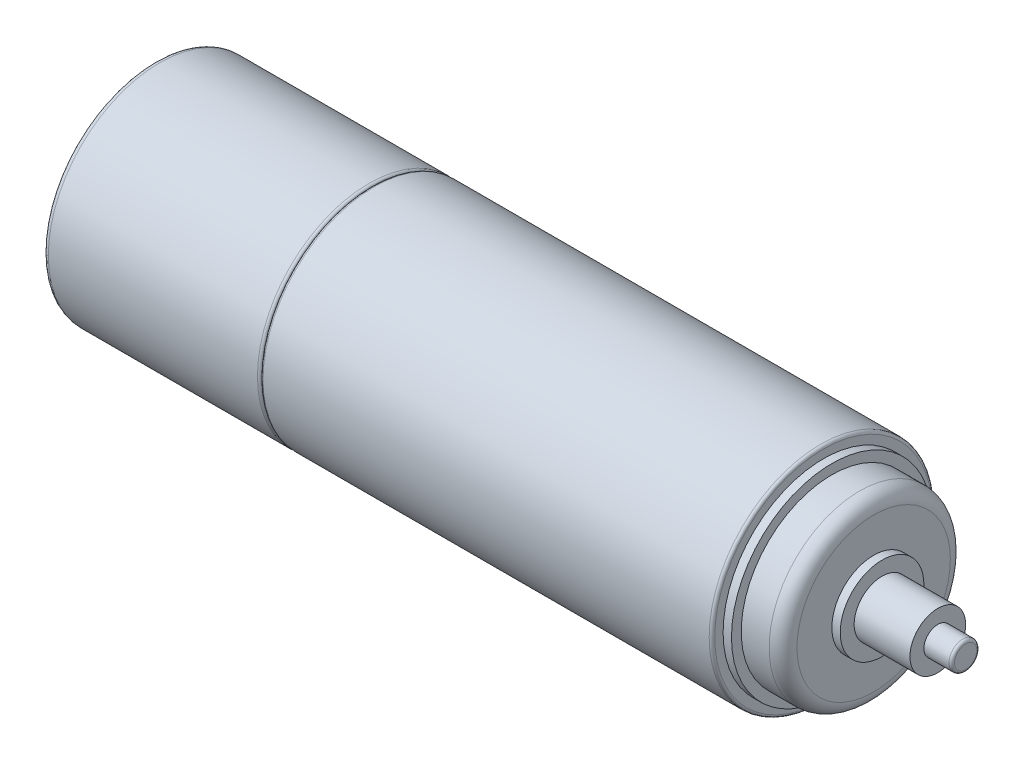
ISO-10303-21;
HEADER;
FILE_DESCRIPTION(('STEP AP214'),'2;1');
FILE_NAME('part.step','',(''),(''),'','','');
FILE_SCHEMA(('AUTOMOTIVE_DESIGN { 1 0 10303 214 1 1 1 1 }'));
ENDSEC;
DATA;
#1=APPLICATION_CONTEXT('core data for automotive mechanical design processes');
#2=APPLICATION_PROTOCOL_DEFINITION('international standard','automotive_design',2000,#1);
#3=PRODUCT_CONTEXT('',#1,'mechanical');
#4=PRODUCT('Part','Part','',(#3));
#5=PRODUCT_RELATED_PRODUCT_CATEGORY('part','',(#4));
#6=PRODUCT_DEFINITION_FORMATION('','',#4);
#7=PRODUCT_DEFINITION_CONTEXT('part definition',#1,'design');
#8=PRODUCT_DEFINITION('design','',#6,#7);
#9=PRODUCT_DEFINITION_SHAPE('','',#8);
#10=(LENGTH_UNIT() NAMED_UNIT(*) SI_UNIT(.MILLI.,.METRE.));
#11=(NAMED_UNIT(*) PLANE_ANGLE_UNIT() SI_UNIT($,.RADIAN.));
#12=(NAMED_UNIT(*) SI_UNIT($,.STERADIAN.) SOLID_ANGLE_UNIT());
#13=UNCERTAINTY_MEASURE_WITH_UNIT(LENGTH_MEASURE(1.E-05),#10,'distance_accuracy_value','');
#14=(GEOMETRIC_REPRESENTATION_CONTEXT(3) GLOBAL_UNCERTAINTY_ASSIGNED_CONTEXT((#13)) GLOBAL_UNIT_ASSIGNED_CONTEXT((#10,
#11,#12)) REPRESENTATION_CONTEXT('',''));
#15=CARTESIAN_POINT('',(0.,0.,0.));
#16=DIRECTION('',(0.,0.,1.));
#17=DIRECTION('',(1.,0.,0.));
#18=AXIS2_PLACEMENT_3D('',#15,#16,#17);
#19=CARTESIAN_POINT('',(16.2,-15.3493565143376,12.114049009447));
#20=DIRECTION('',(-1.,0.,0.));
#21=DIRECTION('',(0.,0.,1.));
#22=AXIS2_PLACEMENT_3D('',#19,#20,#21);
#23=CYLINDRICAL_SURFACE('',#22,4.);
#24=CARTESIAN_POINT('',(16.1,-15.3493565143376,12.114049009447));
#25=DIRECTION('',(1.,0.,0.));
#26=DIRECTION('',(0.,0.,-1.));
#27=AXIS2_PLACEMENT_3D('',#24,#25,#26);
#28=CIRCLE('',#27,4.);
#29=CARTESIAN_POINT('',(16.1,-15.3493565143376,8.11404900944702));
#30=VERTEX_POINT('',#29);
#31=EDGE_CURVE('E55',#30,#30,#28,.F.);
#32=ORIENTED_EDGE('',*,*,#31,.T.);
#33=EDGE_LOOP('',(#32));
#34=FACE_BOUND('',#33,.T.);
#35=CARTESIAN_POINT('',(0.0999999999999994,-15.3493565143376,12.114049009447));
#36=DIRECTION('',(1.,0.,0.));
#37=DIRECTION('',(0.,0.,-1.));
#38=AXIS2_PLACEMENT_3D('',#35,#36,#37);
#39=CIRCLE('',#38,4.);
#40=CARTESIAN_POINT('',(0.0999999999999994,-15.3493565143376,8.11404900944702));
#41=VERTEX_POINT('',#40);
#42=EDGE_CURVE('E64',#41,#41,#39,.T.);
#43=ORIENTED_EDGE('',*,*,#42,.T.);
#44=EDGE_LOOP('',(#43));
#45=FACE_BOUND('',#44,.T.);
#46=ADVANCED_FACE('F32',(#34,#45),#23,.T.);
#47=CARTESIAN_POINT('',(16.2,-15.3493565143376,12.114049009447));
#48=DIRECTION('',(1.,0.,0.));
#49=DIRECTION('',(0.,0.,-1.));
#50=AXIS2_PLACEMENT_3D('',#47,#48,#49);
#51=PLANE('',#50);
#52=CARTESIAN_POINT('',(16.2,-15.3493565143376,12.114049009447));
#53=DIRECTION('',(1.,0.,0.));
#54=DIRECTION('',(0.,0.,-1.));
#55=AXIS2_PLACEMENT_3D('',#52,#53,#54);
#56=CIRCLE('',#55,3.9);
#57=CARTESIAN_POINT('',(16.2,-15.3493565143376,8.21404900944703));
#58=VERTEX_POINT('',#57);
#59=EDGE_CURVE('E58',#58,#58,#56,.T.);
#60=ORIENTED_EDGE('',*,*,#59,.T.);
#61=EDGE_LOOP('',(#60));
#62=FACE_BOUND('',#61,.T.);
#63=CARTESIAN_POINT('',(16.2,-15.3493565143376,12.114049009447));
#64=DIRECTION('',(1.,0.,0.));
#65=DIRECTION('',(0.,0.,-1.));
#66=AXIS2_PLACEMENT_3D('',#63,#64,#65);
#67=CIRCLE('',#66,3.6);
#68=CARTESIAN_POINT('',(16.2,-15.3493565143376,8.51404900944703));
#69=VERTEX_POINT('',#68);
#70=EDGE_CURVE('E76',#69,#69,#67,.T.);
#71=ORIENTED_EDGE('',*,*,#70,.F.);
#72=EDGE_LOOP('',(#71));
#73=FACE_BOUND('',#72,.T.);
#74=ADVANCED_FACE('F142',(#62,#73),#51,.T.);
#75=CARTESIAN_POINT('',(16.5,-15.3493565143376,12.114049009447));
#76=DIRECTION('',(-1.,0.,0.));
#77=DIRECTION('',(0.,0.,1.));
#78=AXIS2_PLACEMENT_3D('',#75,#76,#77);
#79=CYLINDRICAL_SURFACE('',#78,3.6);
#80=CARTESIAN_POINT('',(16.5,-15.3493565143376,12.114049009447));
#81=DIRECTION('',(1.,0.,0.));
#82=DIRECTION('',(0.,0.,-1.));
#83=AXIS2_PLACEMENT_3D('',#80,#81,#82);
#84=CIRCLE('',#83,3.6);
#85=CARTESIAN_POINT('',(16.5,-15.3493565143376,8.51404900944703));
#86=VERTEX_POINT('',#85);
#87=EDGE_CURVE('E79',#86,#86,#84,.T.);
#88=ORIENTED_EDGE('',*,*,#87,.F.);
#89=EDGE_LOOP('',(#88));
#90=FACE_BOUND('',#89,.T.);
#91=ORIENTED_EDGE('',*,*,#70,.T.);
#92=EDGE_LOOP('',(#91));
#93=FACE_BOUND('',#92,.T.);
#94=ADVANCED_FACE('F148',(#90,#93),#79,.T.);
#95=CARTESIAN_POINT('',(16.5,-15.3493565143376,12.114049009447));
#96=DIRECTION('',(1.,0.,0.));
#97=DIRECTION('',(0.,0.,-1.));
#98=AXIS2_PLACEMENT_3D('',#95,#96,#97);
#99=PLANE('',#98);
#100=CARTESIAN_POINT('',(16.5,-15.3493565143376,12.114049009447));
#101=DIRECTION('',(1.,0.,0.));
#102=DIRECTION('',(0.,0.,-1.));
#103=AXIS2_PLACEMENT_3D('',#100,#101,#102);
#104=CIRCLE('',#103,3.25);
#105=CARTESIAN_POINT('',(16.5,-15.3493565143376,8.86404900944703));
#106=VERTEX_POINT('',#105);
#107=EDGE_CURVE('E75',#106,#106,#104,.T.);
#108=ORIENTED_EDGE('',*,*,#107,.F.);
#109=EDGE_LOOP('',(#108));
#110=FACE_BOUND('',#109,.T.);
#111=ORIENTED_EDGE('',*,*,#87,.T.);
#112=EDGE_LOOP('',(#111));
#113=FACE_BOUND('',#112,.T.);
#114=ADVANCED_FACE('F155',(#110,#113),#99,.T.);
#115=CARTESIAN_POINT('',(18.,-15.3493565143376,12.114049009447));
#116=DIRECTION('',(-1.,0.,0.));
#117=DIRECTION('',(0.,0.,1.));
#118=AXIS2_PLACEMENT_3D('',#115,#116,#117);
#119=CYLINDRICAL_SURFACE('',#118,3.25);
#120=CARTESIAN_POINT('',(17.5,-15.3493565143376,12.114049009447));
#121=DIRECTION('',(1.,0.,0.));
#122=DIRECTION('',(0.,0.,-1.));
#123=AXIS2_PLACEMENT_3D('',#120,#121,#122);
#124=CIRCLE('',#123,3.25);
#125=CARTESIAN_POINT('',(17.5,-15.3493565143376,8.86404900944703));
#126=VERTEX_POINT('',#125);
#127=EDGE_CURVE('E68',#126,#126,#124,.F.);
#128=ORIENTED_EDGE('',*,*,#127,.T.);
#129=EDGE_LOOP('',(#128));
#130=FACE_BOUND('',#129,.T.);
#131=ORIENTED_EDGE('',*,*,#107,.T.);
#132=EDGE_LOOP('',(#131));
#133=FACE_BOUND('',#132,.T.);
#134=ADVANCED_FACE('F128',(#130,#133),#119,.T.);
#135=CARTESIAN_POINT('',(18.,-15.3493565143376,12.114049009447));
#136=DIRECTION('',(1.,0.,0.));
#137=DIRECTION('',(0.,0.,-1.));
#138=AXIS2_PLACEMENT_3D('',#135,#136,#137);
#139=PLANE('',#138);
#140=CARTESIAN_POINT('',(18.,-15.3493565143376,12.114049009447));
#141=DIRECTION('',(1.,0.,0.));
#142=DIRECTION('',(0.,0.,-1.));
#143=AXIS2_PLACEMENT_3D('',#140,#141,#142);
#144=CIRCLE('',#143,1.5);
#145=CARTESIAN_POINT('',(18.,-15.3493565143376,10.614049009447));
#146=VERTEX_POINT('',#145);
#147=EDGE_CURVE('E85',#146,#146,#144,.T.);
#148=ORIENTED_EDGE('',*,*,#147,.F.);
#149=EDGE_LOOP('',(#148));
#150=FACE_BOUND('',#149,.T.);
#151=CARTESIAN_POINT('',(18.,-15.3493565143376,12.114049009447));
#152=DIRECTION('',(1.,0.,0.));
#153=DIRECTION('',(0.,0.,-1.));
#154=AXIS2_PLACEMENT_3D('',#151,#152,#153);
#155=CIRCLE('',#154,2.75);
#156=CARTESIAN_POINT('',(18.,-15.3493565143376,9.36404900944703));
#157=VERTEX_POINT('',#156);
#158=EDGE_CURVE('E72',#157,#157,#155,.T.);
#159=ORIENTED_EDGE('',*,*,#158,.T.);
#160=EDGE_LOOP('',(#159));
#161=FACE_BOUND('',#160,.T.);
#162=ADVANCED_FACE('F125',(#150,#161),#139,.T.);
#163=CARTESIAN_POINT('',(17.5,-15.3493565143376,12.114049009447));
#164=DIRECTION('',(1.,0.,0.));
#165=DIRECTION('',(0.,0.,-1.));
#166=AXIS2_PLACEMENT_3D('',#163,#164,#165);
#167=TOROIDAL_SURFACE('',#166,2.75,0.5);
#168=ORIENTED_EDGE('',*,*,#127,.F.);
#169=EDGE_LOOP('',(#168));
#170=FACE_BOUND('',#169,.T.);
#171=ORIENTED_EDGE('',*,*,#158,.F.);
#172=EDGE_LOOP('',(#171));
#173=FACE_BOUND('',#172,.T.);
#174=ADVANCED_FACE('F121',(#170,#173),#167,.T.);
#175=CARTESIAN_POINT('',(18.3,-15.3493565143376,12.114049009447));
#176=DIRECTION('',(-1.,0.,0.));
#177=DIRECTION('',(0.,0.,1.));
#178=AXIS2_PLACEMENT_3D('',#175,#176,#177);
#179=CYLINDRICAL_SURFACE('',#178,1.5);
#180=CARTESIAN_POINT('',(18.3,-15.3493565143376,12.114049009447));
#181=DIRECTION('',(1.,0.,0.));
#182=DIRECTION('',(0.,0.,-1.));
#183=AXIS2_PLACEMENT_3D('',#180,#181,#182);
#184=CIRCLE('',#183,1.5);
#185=CARTESIAN_POINT('',(18.3,-15.3493565143376,10.614049009447));
#186=VERTEX_POINT('',#185);
#187=EDGE_CURVE('E82',#186,#186,#184,.T.);
#188=ORIENTED_EDGE('',*,*,#187,.F.);
#189=EDGE_LOOP('',(#188));
#190=FACE_BOUND('',#189,.T.);
#191=ORIENTED_EDGE('',*,*,#147,.T.);
#192=EDGE_LOOP('',(#191));
#193=FACE_BOUND('',#192,.T.);
#194=ADVANCED_FACE('F115',(#190,#193),#179,.T.);
#195=CARTESIAN_POINT('',(18.3,-15.3493565143376,12.114049009447));
#196=DIRECTION('',(1.,0.,0.));
#197=DIRECTION('',(0.,0.,-1.));
#198=AXIS2_PLACEMENT_3D('',#195,#196,#197);
#199=PLANE('',#198);
#200=CARTESIAN_POINT('',(18.3,-15.3493565143376,12.114049009447));
#201=DIRECTION('',(1.,0.,0.));
#202=DIRECTION('',(0.,0.,-1.));
#203=AXIS2_PLACEMENT_3D('',#200,#201,#202);
#204=CIRCLE('',#203,0.999999999999999);
#205=CARTESIAN_POINT('',(18.3,-15.3493565143376,11.114049009447));
#206=VERTEX_POINT('',#205);
#207=EDGE_CURVE('E71',#206,#206,#204,.T.);
#208=ORIENTED_EDGE('',*,*,#207,.F.);
#209=EDGE_LOOP('',(#208));
#210=FACE_BOUND('',#209,.T.);
#211=ORIENTED_EDGE('',*,*,#187,.T.);
#212=EDGE_LOOP('',(#211));
#213=FACE_BOUND('',#212,.T.);
#214=ADVANCED_FACE('F109',(#210,#213),#199,.T.);
#215=CARTESIAN_POINT('',(20.3,-15.3493565143376,12.114049009447));
#216=DIRECTION('',(-1.,0.,0.));
#217=DIRECTION('',(0.,0.,1.));
#218=AXIS2_PLACEMENT_3D('',#215,#216,#217);
#219=CYLINDRICAL_SURFACE('',#218,0.999999999999999);
#220=CARTESIAN_POINT('',(20.3,-15.3493565143376,12.114049009447));
#221=DIRECTION('',(1.,0.,0.));
#222=DIRECTION('',(0.,0.,-1.));
#223=AXIS2_PLACEMENT_3D('',#220,#221,#222);
#224=CIRCLE('',#223,0.999999999999999);
#225=CARTESIAN_POINT('',(20.3,-15.3493565143376,11.114049009447));
#226=VERTEX_POINT('',#225);
#227=EDGE_CURVE('E88',#226,#226,#224,.T.);
#228=ORIENTED_EDGE('',*,*,#227,.F.);
#229=EDGE_LOOP('',(#228));
#230=FACE_BOUND('',#229,.T.);
#231=ORIENTED_EDGE('',*,*,#207,.T.);
#232=EDGE_LOOP('',(#231));
#233=FACE_BOUND('',#232,.T.);
#234=ADVANCED_FACE('F103',(#230,#233),#219,.T.);
#235=CARTESIAN_POINT('',(20.3,-15.3493565143376,12.114049009447));
#236=DIRECTION('',(1.,0.,0.));
#237=DIRECTION('',(0.,0.,-1.));
#238=AXIS2_PLACEMENT_3D('',#235,#236,#237);
#239=PLANE('',#238);
#240=CARTESIAN_POINT('',(20.3,-15.3493565143376,12.114049009447));
#241=DIRECTION('',(1.,0.,0.));
#242=DIRECTION('',(0.,0.,-1.));
#243=AXIS2_PLACEMENT_3D('',#240,#241,#242);
#244=CIRCLE('',#243,0.500000000000001);
#245=CARTESIAN_POINT('',(20.3,-15.3493565143376,11.614049009447));
#246=VERTEX_POINT('',#245);
#247=EDGE_CURVE('E67',#246,#246,#244,.T.);
#248=ORIENTED_EDGE('',*,*,#247,.F.);
#249=EDGE_LOOP('',(#248));
#250=FACE_BOUND('',#249,.T.);
#251=ORIENTED_EDGE('',*,*,#227,.T.);
#252=EDGE_LOOP('',(#251));
#253=FACE_BOUND('',#252,.T.);
#254=ADVANCED_FACE('F100',(#250,#253),#239,.T.);
#255=CARTESIAN_POINT('',(21.3,-15.3493565143376,12.114049009447));
#256=DIRECTION('',(-1.,0.,0.));
#257=DIRECTION('',(0.,0.,1.));
#258=AXIS2_PLACEMENT_3D('',#255,#256,#257);
#259=CYLINDRICAL_SURFACE('',#258,0.500000000000001);
#260=CARTESIAN_POINT('',(21.2,-15.3493565143376,12.114049009447));
#261=DIRECTION('',(1.,0.,0.));
#262=DIRECTION('',(0.,0.,-1.));
#263=AXIS2_PLACEMENT_3D('',#260,#261,#262);
#264=CIRCLE('',#263,0.500000000000001);
#265=CARTESIAN_POINT('',(21.2,-15.3493565143376,11.614049009447));
#266=VERTEX_POINT('',#265);
#267=EDGE_CURVE('E10',#266,#266,#264,.F.);
#268=ORIENTED_EDGE('',*,*,#267,.T.);
#269=EDGE_LOOP('',(#268));
#270=FACE_BOUND('',#269,.T.);
#271=ORIENTED_EDGE('',*,*,#247,.T.);
#272=EDGE_LOOP('',(#271));
#273=FACE_BOUND('',#272,.T.);
#274=ADVANCED_FACE('F98',(#270,#273),#259,.T.);
#275=CARTESIAN_POINT('',(21.3,-15.3493565143376,12.114049009447));
#276=DIRECTION('',(1.,0.,0.));
#277=DIRECTION('',(0.,0.,-1.));
#278=AXIS2_PLACEMENT_3D('',#275,#276,#277);
#279=PLANE('',#278);
#280=CARTESIAN_POINT('',(21.3,-15.3493565143376,12.114049009447));
#281=DIRECTION('',(1.,0.,0.));
#282=DIRECTION('',(0.,0.,-1.));
#283=AXIS2_PLACEMENT_3D('',#280,#281,#282);
#284=CIRCLE('',#283,0.400000000000001);
#285=CARTESIAN_POINT('',(21.3,-15.3493565143376,11.714049009447));
#286=VERTEX_POINT('',#285);
#287=EDGE_CURVE('E39',#286,#286,#284,.T.);
#288=ORIENTED_EDGE('',*,*,#287,.T.);
#289=EDGE_LOOP('',(#288));
#290=FACE_BOUND('',#289,.T.);
#291=ADVANCED_FACE('F164',(#290),#279,.T.);
#292=CARTESIAN_POINT('',(0.0999999999999994,-15.3493565143376,12.114049009447));
#293=DIRECTION('',(1.,0.,0.));
#294=DIRECTION('',(0.,0.,-1.));
#295=AXIS2_PLACEMENT_3D('',#292,#293,#294);
#296=TOROIDAL_SURFACE('',#295,3.9,0.1);
#297=CARTESIAN_POINT('',(0.,-15.3493565143376,12.114049009447));
#298=DIRECTION('',(1.,0.,0.));
#299=DIRECTION('',(0.,0.,-1.));
#300=AXIS2_PLACEMENT_3D('',#297,#298,#299);
#301=CIRCLE('',#300,3.9);
#302=CARTESIAN_POINT('',(0.,-15.3493565143376,8.21404900944703));
#303=VERTEX_POINT('',#302);
#304=EDGE_CURVE('E61',#303,#303,#301,.F.);
#305=ORIENTED_EDGE('',*,*,#304,.F.);
#306=EDGE_LOOP('',(#305));
#307=FACE_BOUND('',#306,.T.);
#308=ORIENTED_EDGE('',*,*,#42,.F.);
#309=EDGE_LOOP('',(#308));
#310=FACE_BOUND('',#309,.T.);
#311=ADVANCED_FACE('F167',(#307,#310),#296,.T.);
#312=CARTESIAN_POINT('',(16.1,-15.3493565143376,12.114049009447));
#313=DIRECTION('',(1.,0.,0.));
#314=DIRECTION('',(0.,0.,-1.));
#315=AXIS2_PLACEMENT_3D('',#312,#313,#314);
#316=TOROIDAL_SURFACE('',#315,3.9,0.1);
#317=ORIENTED_EDGE('',*,*,#31,.F.);
#318=EDGE_LOOP('',(#317));
#319=FACE_BOUND('',#318,.T.);
#320=ORIENTED_EDGE('',*,*,#59,.F.);
#321=EDGE_LOOP('',(#320));
#322=FACE_BOUND('',#321,.T.);
#323=ADVANCED_FACE('F172',(#319,#322),#316,.T.);
#324=CARTESIAN_POINT('',(-7.8,-15.3493565143376,12.114049009447));
#325=DIRECTION('',(1.,0.,0.));
#326=DIRECTION('',(0.,0.,-1.));
#327=AXIS2_PLACEMENT_3D('',#324,#325,#326);
#328=CYLINDRICAL_SURFACE('',#327,4.);
#329=CARTESIAN_POINT('',(-0.1,-15.3493565143376,12.114049009447));
#330=DIRECTION('',(-1.,0.,0.));
#331=DIRECTION('',(0.,0.,1.));
#332=AXIS2_PLACEMENT_3D('',#329,#330,#331);
#333=CIRCLE('',#332,4.);
#334=CARTESIAN_POINT('',(-0.1,-15.3493565143376,16.114049009447));
#335=VERTEX_POINT('',#334);
#336=EDGE_CURVE('E43',#335,#335,#333,.T.);
#337=ORIENTED_EDGE('',*,*,#336,.T.);
#338=EDGE_LOOP('',(#337));
#339=FACE_BOUND('',#338,.T.);
#340=CARTESIAN_POINT('',(-7.6,-15.3493565143376,12.114049009447));
#341=DIRECTION('',(-1.,0.,0.));
#342=DIRECTION('',(0.,0.,1.));
#343=AXIS2_PLACEMENT_3D('',#340,#341,#342);
#344=CIRCLE('',#343,4.);
#345=CARTESIAN_POINT('',(-7.6,-15.3493565143376,16.114049009447));
#346=VERTEX_POINT('',#345);
#347=EDGE_CURVE('E47',#346,#346,#344,.F.);
#348=ORIENTED_EDGE('',*,*,#347,.T.);
#349=EDGE_LOOP('',(#348));
#350=FACE_BOUND('',#349,.T.);
#351=ADVANCED_FACE('F168',(#339,#350),#328,.T.);
#352=CARTESIAN_POINT('',(-7.8,-15.3493565143376,12.114049009447));
#353=DIRECTION('',(-1.,0.,0.));
#354=DIRECTION('',(0.,0.,1.));
#355=AXIS2_PLACEMENT_3D('',#352,#353,#354);
#356=PLANE('',#355);
#357=CARTESIAN_POINT('',(-7.8,-15.3493565143376,12.114049009447));
#358=DIRECTION('',(-1.,0.,0.));
#359=DIRECTION('',(0.,0.,1.));
#360=AXIS2_PLACEMENT_3D('',#357,#358,#359);
#361=CIRCLE('',#360,3.8);
#362=CARTESIAN_POINT('',(-7.8,-15.3493565143376,15.914049009447));
#363=VERTEX_POINT('',#362);
#364=EDGE_CURVE('E52',#363,#363,#361,.T.);
#365=ORIENTED_EDGE('',*,*,#364,.T.);
#366=EDGE_LOOP('',(#365));
#367=FACE_BOUND('',#366,.T.);
#368=ADVANCED_FACE('F171',(#367),#356,.T.);
#369=CARTESIAN_POINT('',(-7.6,-15.3493565143376,12.114049009447));
#370=DIRECTION('',(-1.,0.,0.));
#371=DIRECTION('',(0.,0.,1.));
#372=AXIS2_PLACEMENT_3D('',#369,#370,#371);
#373=TOROIDAL_SURFACE('',#372,3.8,0.2);
#374=ORIENTED_EDGE('',*,*,#347,.F.);
#375=EDGE_LOOP('',(#374));
#376=FACE_BOUND('',#375,.T.);
#377=ORIENTED_EDGE('',*,*,#364,.F.);
#378=EDGE_LOOP('',(#377));
#379=FACE_BOUND('',#378,.T.);
#380=ADVANCED_FACE('F175',(#376,#379),#373,.T.);
#381=CARTESIAN_POINT('',(-0.1,-15.3493565143376,12.114049009447));
#382=DIRECTION('',(-1.,0.,0.));
#383=DIRECTION('',(0.,0.,1.));
#384=AXIS2_PLACEMENT_3D('',#381,#382,#383);
#385=TOROIDAL_SURFACE('',#384,3.9,0.1);
#386=ORIENTED_EDGE('',*,*,#304,.T.);
#387=EDGE_LOOP('',(#386));
#388=FACE_BOUND('',#387,.T.);
#389=ORIENTED_EDGE('',*,*,#336,.F.);
#390=EDGE_LOOP('',(#389));
#391=FACE_BOUND('',#390,.T.);
#392=ADVANCED_FACE('F180',(#388,#391),#385,.T.);
#393=CARTESIAN_POINT('',(21.2,-15.3493565143376,12.114049009447));
#394=DIRECTION('',(1.,0.,0.));
#395=DIRECTION('',(0.,0.,-1.));
#396=AXIS2_PLACEMENT_3D('',#393,#394,#395);
#397=TOROIDAL_SURFACE('',#396,0.400000000000001,0.1);
#398=ORIENTED_EDGE('',*,*,#267,.F.);
#399=EDGE_LOOP('',(#398));
#400=FACE_BOUND('',#399,.T.);
#401=ORIENTED_EDGE('',*,*,#287,.F.);
#402=EDGE_LOOP('',(#401));
#403=FACE_BOUND('',#402,.T.);
#404=ADVANCED_FACE('F34',(#400,#403),#397,.T.);
#405=CLOSED_SHELL('',(#46,#74,#94,#114,#134,#162,#174,#194,#214,#234,#254,#274,#291,#311,#323,
#351,#368,#380,#392,#404));
#406=MANIFOLD_SOLID_BREP('B2',#405);
#407=ADVANCED_BREP_SHAPE_REPRESENTATION('',(#18,#406),#14);
#408=SHAPE_DEFINITION_REPRESENTATION(#9,#407);
ENDSEC;
END-ISO-10303-21;
